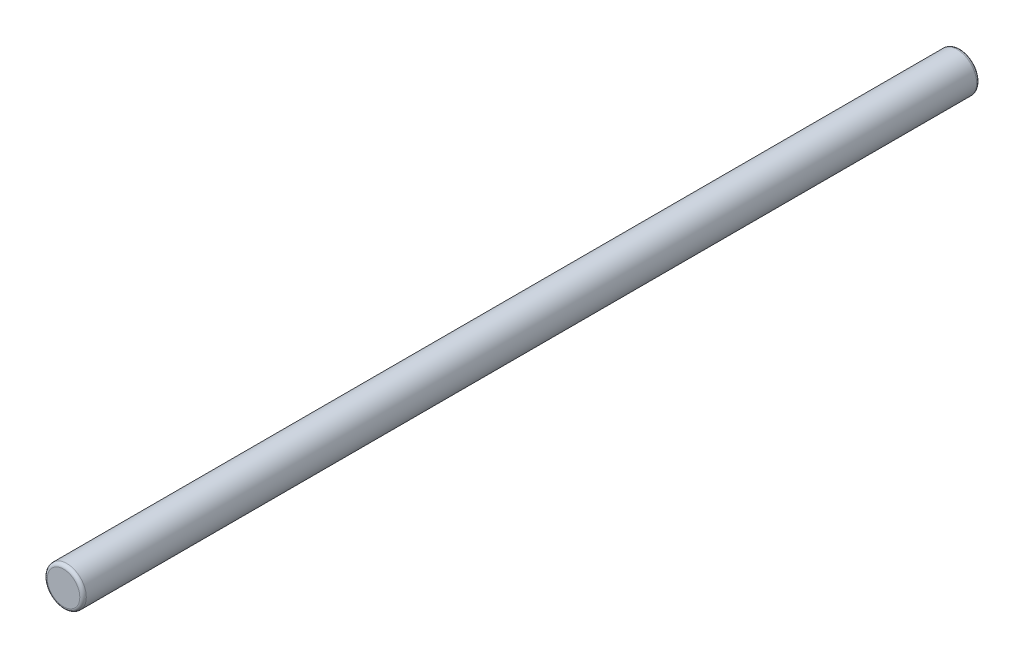
ISO-10303-21;
HEADER;
FILE_DESCRIPTION(('STEP AP214'),'2;1');
FILE_NAME('part.step','',(''),(''),'','','');
FILE_SCHEMA(('AUTOMOTIVE_DESIGN { 1 0 10303 214 1 1 1 1 }'));
ENDSEC;
DATA;
#1=APPLICATION_CONTEXT('core data for automotive mechanical design processes');
#2=APPLICATION_PROTOCOL_DEFINITION('international standard','automotive_design',2000,#1);
#3=PRODUCT_CONTEXT('',#1,'mechanical');
#4=PRODUCT('Part','Part','',(#3));
#5=PRODUCT_RELATED_PRODUCT_CATEGORY('part','',(#4));
#6=PRODUCT_DEFINITION_FORMATION('','',#4);
#7=PRODUCT_DEFINITION_CONTEXT('part definition',#1,'design');
#8=PRODUCT_DEFINITION('design','',#6,#7);
#9=PRODUCT_DEFINITION_SHAPE('','',#8);
#10=(LENGTH_UNIT() NAMED_UNIT(*) SI_UNIT(.MILLI.,.METRE.));
#11=(NAMED_UNIT(*) PLANE_ANGLE_UNIT() SI_UNIT($,.RADIAN.));
#12=(NAMED_UNIT(*) SI_UNIT($,.STERADIAN.) SOLID_ANGLE_UNIT());
#13=UNCERTAINTY_MEASURE_WITH_UNIT(LENGTH_MEASURE(1.E-05),#10,'distance_accuracy_value','');
#14=(GEOMETRIC_REPRESENTATION_CONTEXT(3) GLOBAL_UNCERTAINTY_ASSIGNED_CONTEXT((#13)) GLOBAL_UNIT_ASSIGNED_CONTEXT((#10,
#11,#12)) REPRESENTATION_CONTEXT('',''));
#15=CARTESIAN_POINT('',(0.,0.,0.));
#16=DIRECTION('',(0.,0.,1.));
#17=DIRECTION('',(1.,0.,0.));
#18=AXIS2_PLACEMENT_3D('',#15,#16,#17);
#19=CARTESIAN_POINT('',(0.,0.,138.));
#20=DIRECTION('',(0.,0.,-1.));
#21=DIRECTION('',(-1.,0.,0.));
#22=AXIS2_PLACEMENT_3D('',#19,#20,#21);
#23=CYLINDRICAL_SURFACE('',#22,3.);
#24=CARTESIAN_POINT('',(0.,0.,0.5));
#25=DIRECTION('',(0.,0.,1.));
#26=DIRECTION('',(1.,0.,0.));
#27=AXIS2_PLACEMENT_3D('',#24,#25,#26);
#28=CIRCLE('',#27,3.);
#29=CARTESIAN_POINT('',(3.,0.,0.5));
#30=VERTEX_POINT('',#29);
#31=EDGE_CURVE('E52',#30,#30,#28,.T.);
#32=ORIENTED_EDGE('',*,*,#31,.T.);
#33=EDGE_LOOP('',(#32));
#34=FACE_BOUND('',#33,.T.);
#35=CARTESIAN_POINT('',(0.,0.,137.5));
#36=DIRECTION('',(0.,0.,1.));
#37=DIRECTION('',(1.,0.,0.));
#38=AXIS2_PLACEMENT_3D('',#35,#36,#37);
#39=CIRCLE('',#38,3.);
#40=CARTESIAN_POINT('',(3.,0.,137.5));
#41=VERTEX_POINT('',#40);
#42=EDGE_CURVE('E56',#41,#41,#39,.F.);
#43=ORIENTED_EDGE('',*,*,#42,.T.);
#44=EDGE_LOOP('',(#43));
#45=FACE_BOUND('',#44,.T.);
#46=ADVANCED_FACE('F41',(#34,#45),#23,.T.);
#47=CARTESIAN_POINT('',(0.,0.,138.));
#48=DIRECTION('',(0.,0.,1.));
#49=DIRECTION('',(1.,0.,0.));
#50=AXIS2_PLACEMENT_3D('',#47,#48,#49);
#51=PLANE('',#50);
#52=CARTESIAN_POINT('',(0.,0.,138.));
#53=DIRECTION('',(0.,0.,1.));
#54=DIRECTION('',(1.,0.,0.));
#55=AXIS2_PLACEMENT_3D('',#52,#53,#54);
#56=CIRCLE('',#55,2.5);
#57=CARTESIAN_POINT('',(2.5,0.,138.));
#58=VERTEX_POINT('',#57);
#59=EDGE_CURVE('E10',#58,#58,#56,.T.);
#60=ORIENTED_EDGE('',*,*,#59,.T.);
#61=EDGE_LOOP('',(#60));
#62=FACE_BOUND('',#61,.T.);
#63=ADVANCED_FACE('F72',(#62),#51,.T.);
#64=CARTESIAN_POINT('',(0.,0.,0.));
#65=DIRECTION('',(0.,0.,1.));
#66=DIRECTION('',(1.,0.,0.));
#67=AXIS2_PLACEMENT_3D('',#64,#65,#66);
#68=PLANE('',#67);
#69=CARTESIAN_POINT('',(0.,0.,0.));
#70=DIRECTION('',(0.,0.,1.));
#71=DIRECTION('',(1.,0.,0.));
#72=AXIS2_PLACEMENT_3D('',#69,#70,#71);
#73=CIRCLE('',#72,2.5);
#74=CARTESIAN_POINT('',(2.5,0.,0.));
#75=VERTEX_POINT('',#74);
#76=EDGE_CURVE('E48',#75,#75,#73,.F.);
#77=ORIENTED_EDGE('',*,*,#76,.T.);
#78=EDGE_LOOP('',(#77));
#79=FACE_BOUND('',#78,.T.);
#80=ADVANCED_FACE('F69',(#79),#68,.F.);
#81=CARTESIAN_POINT('',(0.,0.,0.5));
#82=DIRECTION('',(0.,0.,1.));
#83=DIRECTION('',(1.,0.,0.));
#84=AXIS2_PLACEMENT_3D('',#81,#82,#83);
#85=TOROIDAL_SURFACE('',#84,2.5,0.5);
#86=ORIENTED_EDGE('',*,*,#76,.F.);
#87=EDGE_LOOP('',(#86));
#88=FACE_BOUND('',#87,.T.);
#89=ORIENTED_EDGE('',*,*,#31,.F.);
#90=EDGE_LOOP('',(#89));
#91=FACE_BOUND('',#90,.T.);
#92=ADVANCED_FACE('F65',(#88,#91),#85,.T.);
#93=CARTESIAN_POINT('',(0.,0.,137.5));
#94=DIRECTION('',(0.,0.,1.));
#95=DIRECTION('',(1.,0.,0.));
#96=AXIS2_PLACEMENT_3D('',#93,#94,#95);
#97=TOROIDAL_SURFACE('',#96,2.5,0.5);
#98=ORIENTED_EDGE('',*,*,#42,.F.);
#99=EDGE_LOOP('',(#98));
#100=FACE_BOUND('',#99,.T.);
#101=ORIENTED_EDGE('',*,*,#59,.F.);
#102=EDGE_LOOP('',(#101));
#103=FACE_BOUND('',#102,.T.);
#104=ADVANCED_FACE('F43',(#100,#103),#97,.T.);
#105=CLOSED_SHELL('',(#46,#63,#80,#92,#104));
#106=MANIFOLD_SOLID_BREP('B2',#105);
#107=ADVANCED_BREP_SHAPE_REPRESENTATION('',(#18,#106),#14);
#108=SHAPE_DEFINITION_REPRESENTATION(#9,#107);
ENDSEC;
END-ISO-10303-21;
